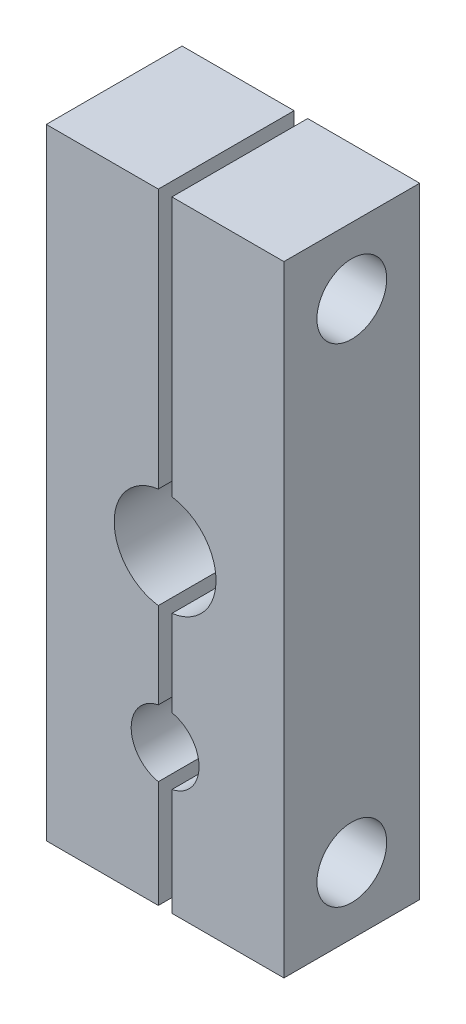
ISO-10303-21;
HEADER;
FILE_DESCRIPTION(('STEP AP214'),'2;1');
FILE_NAME('part.step','',(''),(''),'','','');
FILE_SCHEMA(('AUTOMOTIVE_DESIGN { 1 0 10303 214 1 1 1 1 }'));
ENDSEC;
DATA;
#1=APPLICATION_CONTEXT('core data for automotive mechanical design processes');
#2=APPLICATION_PROTOCOL_DEFINITION('international standard','automotive_design',2000,#1);
#3=PRODUCT_CONTEXT('',#1,'mechanical');
#4=PRODUCT('Part','Part','',(#3));
#5=PRODUCT_RELATED_PRODUCT_CATEGORY('part','',(#4));
#6=PRODUCT_DEFINITION_FORMATION('','',#4);
#7=PRODUCT_DEFINITION_CONTEXT('part definition',#1,'design');
#8=PRODUCT_DEFINITION('design','',#6,#7);
#9=PRODUCT_DEFINITION_SHAPE('','',#8);
#10=(LENGTH_UNIT() NAMED_UNIT(*) SI_UNIT(.MILLI.,.METRE.));
#11=(NAMED_UNIT(*) PLANE_ANGLE_UNIT() SI_UNIT($,.RADIAN.));
#12=(NAMED_UNIT(*) SI_UNIT($,.STERADIAN.) SOLID_ANGLE_UNIT());
#13=UNCERTAINTY_MEASURE_WITH_UNIT(LENGTH_MEASURE(1.E-05),#10,'distance_accuracy_value','');
#14=(GEOMETRIC_REPRESENTATION_CONTEXT(3) GLOBAL_UNCERTAINTY_ASSIGNED_CONTEXT((#13)) GLOBAL_UNIT_ASSIGNED_CONTEXT((#10,
#11,#12)) REPRESENTATION_CONTEXT('',''));
#15=CARTESIAN_POINT('',(0.,0.,0.));
#16=DIRECTION('',(0.,0.,1.));
#17=DIRECTION('',(1.,0.,0.));
#18=AXIS2_PLACEMENT_3D('',#15,#16,#17);
#19=CARTESIAN_POINT('',(0.,0.,6.35));
#20=DIRECTION('',(0.,0.,-1.));
#21=DIRECTION('',(-1.,0.,0.));
#22=AXIS2_PLACEMENT_3D('',#19,#20,#21);
#23=PLANE('',#22);
#24=DIRECTION('',(-1.,0.,0.));
#25=VECTOR('',#24,1.);
#26=CARTESIAN_POINT('',(-11.1125,29.013726834,6.35));
#27=LINE('',#26,#25);
#28=CARTESIAN_POINT('',(11.1125,29.013726834,6.35));
#29=VERTEX_POINT('',#28);
#30=CARTESIAN_POINT('',(0.635000000000004,29.013726834,6.35));
#31=VERTEX_POINT('',#30);
#32=EDGE_CURVE('E155',#29,#31,#27,.T.);
#33=ORIENTED_EDGE('',*,*,#32,.T.);
#34=DIRECTION('',(0.,1.,0.));
#35=VECTOR('',#34,1.);
#36=CARTESIAN_POINT('',(0.635000000000004,-31.0103254822764,6.35));
#37=LINE('',#36,#35);
#38=CARTESIAN_POINT('',(0.635000000000003,4.71997682727362,6.35));
#39=VERTEX_POINT('',#38);
#40=EDGE_CURVE('E56',#39,#31,#37,.T.);
#41=ORIENTED_EDGE('',*,*,#40,.F.);
#42=CARTESIAN_POINT('',(0.,0.,6.35));
#43=DIRECTION('',(0.,0.,1.));
#44=DIRECTION('',(1.,0.,0.));
#45=AXIS2_PLACEMENT_3D('',#42,#43,#44);
#46=CIRCLE('',#45,4.7625);
#47=CARTESIAN_POINT('',(0.635000000000003,-4.71997682727362,6.35));
#48=VERTEX_POINT('',#47);
#49=EDGE_CURVE('E124',#48,#39,#46,.T.);
#50=ORIENTED_EDGE('',*,*,#49,.F.);
#51=CARTESIAN_POINT('',(0.635000000000003,-12.7641480266654,6.35));
#52=VERTEX_POINT('',#51);
#53=EDGE_CURVE('E12',#52,#48,#37,.T.);
#54=ORIENTED_EDGE('',*,*,#53,.F.);
#55=CARTESIAN_POINT('',(0.,-15.875,6.35));
#56=DIRECTION('',(0.,0.,1.));
#57=DIRECTION('',(1.,0.,0.));
#58=AXIS2_PLACEMENT_3D('',#55,#56,#57);
#59=CIRCLE('',#58,3.175);
#60=CARTESIAN_POINT('',(0.635000000000003,-18.9858519733346,6.35));
#61=VERTEX_POINT('',#60);
#62=EDGE_CURVE('E134',#61,#52,#59,.T.);
#63=ORIENTED_EDGE('',*,*,#62,.F.);
#64=CARTESIAN_POINT('',(0.635000000000004,-29.013726834,6.35));
#65=VERTEX_POINT('',#64);
#66=EDGE_CURVE('E55',#65,#61,#37,.T.);
#67=ORIENTED_EDGE('',*,*,#66,.F.);
#68=DIRECTION('',(1.,0.,0.));
#69=VECTOR('',#68,1.);
#70=CARTESIAN_POINT('',(-11.1125,-29.013726834,6.35));
#71=LINE('',#70,#69);
#72=CARTESIAN_POINT('',(11.1125,-29.013726834,6.35));
#73=VERTEX_POINT('',#72);
#74=EDGE_CURVE('E158',#65,#73,#71,.T.);
#75=ORIENTED_EDGE('',*,*,#74,.T.);
#76=DIRECTION('',(0.,1.,0.));
#77=VECTOR('',#76,1.);
#78=CARTESIAN_POINT('',(11.1125,-29.013726834,6.35));
#79=LINE('',#78,#77);
#80=EDGE_CURVE('E115',#73,#29,#79,.T.);
#81=ORIENTED_EDGE('',*,*,#80,.T.);
#82=EDGE_LOOP('',(#33,#41,#50,#54,#63,#67,#75,#81));
#83=FACE_BOUND('',#82,.T.);
#84=ADVANCED_FACE('F43',(#83),#23,.F.);
#85=CARTESIAN_POINT('',(0.,0.,-6.35));
#86=DIRECTION('',(0.,0.,-1.));
#87=DIRECTION('',(-1.,0.,0.));
#88=AXIS2_PLACEMENT_3D('',#85,#86,#87);
#89=PLANE('',#88);
#90=DIRECTION('',(0.,1.,0.));
#91=VECTOR('',#90,1.);
#92=CARTESIAN_POINT('',(0.635000000000004,-31.0103254822764,-6.35));
#93=LINE('',#92,#91);
#94=CARTESIAN_POINT('',(0.635000000000004,4.71997682727363,-6.35));
#95=VERTEX_POINT('',#94);
#96=CARTESIAN_POINT('',(0.635000000000004,29.013726834,-6.35));
#97=VERTEX_POINT('',#96);
#98=EDGE_CURVE('E104',#95,#97,#93,.T.);
#99=ORIENTED_EDGE('',*,*,#98,.T.);
#100=DIRECTION('',(-1.,0.,0.));
#101=VECTOR('',#100,1.);
#102=CARTESIAN_POINT('',(-11.1125,29.013726834,-6.35));
#103=LINE('',#102,#101);
#104=CARTESIAN_POINT('',(11.1125,29.013726834,-6.35));
#105=VERTEX_POINT('',#104);
#106=EDGE_CURVE('E130',#105,#97,#103,.T.);
#107=ORIENTED_EDGE('',*,*,#106,.F.);
#108=DIRECTION('',(0.,1.,0.));
#109=VECTOR('',#108,1.);
#110=CARTESIAN_POINT('',(11.1125,-29.013726834,-6.35));
#111=LINE('',#110,#109);
#112=CARTESIAN_POINT('',(11.1125,-29.013726834,-6.35));
#113=VERTEX_POINT('',#112);
#114=EDGE_CURVE('E172',#113,#105,#111,.T.);
#115=ORIENTED_EDGE('',*,*,#114,.F.);
#116=DIRECTION('',(1.,0.,0.));
#117=VECTOR('',#116,1.);
#118=CARTESIAN_POINT('',(-11.1125,-29.013726834,-6.35));
#119=LINE('',#118,#117);
#120=CARTESIAN_POINT('',(0.635000000000004,-29.013726834,-6.35));
#121=VERTEX_POINT('',#120);
#122=EDGE_CURVE('E144',#121,#113,#119,.T.);
#123=ORIENTED_EDGE('',*,*,#122,.F.);
#124=CARTESIAN_POINT('',(0.635000000000003,-18.9858519733346,-6.35));
#125=VERTEX_POINT('',#124);
#126=EDGE_CURVE('E114',#121,#125,#93,.T.);
#127=ORIENTED_EDGE('',*,*,#126,.T.);
#128=CARTESIAN_POINT('',(0.,-15.875,-6.35));
#129=DIRECTION('',(0.,0.,1.));
#130=DIRECTION('',(1.,0.,0.));
#131=AXIS2_PLACEMENT_3D('',#128,#129,#130);
#132=CIRCLE('',#131,3.175);
#133=CARTESIAN_POINT('',(0.635000000000003,-12.7641480266654,-6.35));
#134=VERTEX_POINT('',#133);
#135=EDGE_CURVE('E47',#125,#134,#132,.T.);
#136=ORIENTED_EDGE('',*,*,#135,.T.);
#137=CARTESIAN_POINT('',(0.635000000000003,-4.71997682727362,-6.35));
#138=VERTEX_POINT('',#137);
#139=EDGE_CURVE('E117',#134,#138,#93,.T.);
#140=ORIENTED_EDGE('',*,*,#139,.T.);
#141=CARTESIAN_POINT('',(0.,0.,-6.35));
#142=DIRECTION('',(0.,0.,1.));
#143=DIRECTION('',(1.,0.,0.));
#144=AXIS2_PLACEMENT_3D('',#141,#142,#143);
#145=CIRCLE('',#144,4.7625);
#146=EDGE_CURVE('E122',#138,#95,#145,.T.);
#147=ORIENTED_EDGE('',*,*,#146,.T.);
#148=EDGE_LOOP('',(#99,#107,#115,#123,#127,#136,#140,#147));
#149=FACE_BOUND('',#148,.T.);
#150=ADVANCED_FACE('F128',(#149),#89,.T.);
#151=CARTESIAN_POINT('',(-11.1125,29.013726834,6.35));
#152=DIRECTION('',(0.,-1.,0.));
#153=DIRECTION('',(0.,0.,-1.));
#154=AXIS2_PLACEMENT_3D('',#151,#152,#153);
#155=PLANE('',#154);
#156=ORIENTED_EDGE('',*,*,#106,.T.);
#157=DIRECTION('',(0.,0.,1.));
#158=VECTOR('',#157,1.);
#159=CARTESIAN_POINT('',(0.635000000000004,29.013726834,6.35));
#160=LINE('',#159,#158);
#161=EDGE_CURVE('E110',#97,#31,#160,.T.);
#162=ORIENTED_EDGE('',*,*,#161,.T.);
#163=ORIENTED_EDGE('',*,*,#32,.F.);
#164=DIRECTION('',(0.,0.,-1.));
#165=VECTOR('',#164,1.);
#166=CARTESIAN_POINT('',(11.1125,29.013726834,6.35));
#167=LINE('',#166,#165);
#168=EDGE_CURVE('E152',#29,#105,#167,.T.);
#169=ORIENTED_EDGE('',*,*,#168,.T.);
#170=EDGE_LOOP('',(#156,#162,#163,#169));
#171=FACE_BOUND('',#170,.T.);
#172=ADVANCED_FACE('F205',(#171),#155,.F.);
#173=CARTESIAN_POINT('',(-11.1125,-29.013726834,6.35));
#174=DIRECTION('',(0.,1.,0.));
#175=DIRECTION('',(0.,0.,1.));
#176=AXIS2_PLACEMENT_3D('',#173,#174,#175);
#177=PLANE('',#176);
#178=ORIENTED_EDGE('',*,*,#74,.F.);
#179=DIRECTION('',(0.,0.,-1.));
#180=VECTOR('',#179,1.);
#181=CARTESIAN_POINT('',(0.635000000000004,-29.013726834,6.35));
#182=LINE('',#181,#180);
#183=EDGE_CURVE('E145',#65,#121,#182,.T.);
#184=ORIENTED_EDGE('',*,*,#183,.T.);
#185=ORIENTED_EDGE('',*,*,#122,.T.);
#186=DIRECTION('',(0.,0.,-1.));
#187=VECTOR('',#186,1.);
#188=CARTESIAN_POINT('',(11.1125,-29.013726834,6.35));
#189=LINE('',#188,#187);
#190=EDGE_CURVE('E125',#73,#113,#189,.T.);
#191=ORIENTED_EDGE('',*,*,#190,.F.);
#192=EDGE_LOOP('',(#178,#184,#185,#191));
#193=FACE_BOUND('',#192,.T.);
#194=ADVANCED_FACE('F228',(#193),#177,.F.);
#195=CARTESIAN_POINT('',(0.,0.,6.35));
#196=DIRECTION('',(0.,0.,-1.));
#197=DIRECTION('',(-1.,0.,0.));
#198=AXIS2_PLACEMENT_3D('',#195,#196,#197);
#199=CYLINDRICAL_SURFACE('',#198,4.7625);
#200=DIRECTION('',(0.,0.,-1.));
#201=VECTOR('',#200,1.);
#202=CARTESIAN_POINT('',(0.635000000000004,-4.71997682727363,6.35));
#203=LINE('',#202,#201);
#204=EDGE_CURVE('E161',#48,#138,#203,.T.);
#205=ORIENTED_EDGE('',*,*,#204,.F.);
#206=ORIENTED_EDGE('',*,*,#49,.T.);
#207=DIRECTION('',(0.,0.,-1.));
#208=VECTOR('',#207,1.);
#209=CARTESIAN_POINT('',(0.635000000000004,4.71997682727363,6.35));
#210=LINE('',#209,#208);
#211=EDGE_CURVE('E107',#95,#39,#210,.F.);
#212=ORIENTED_EDGE('',*,*,#211,.F.);
#213=ORIENTED_EDGE('',*,*,#146,.F.);
#214=EDGE_LOOP('',(#205,#206,#212,#213));
#215=FACE_BOUND('',#214,.T.);
#216=ADVANCED_FACE('F121',(#215),#199,.F.);
#217=CARTESIAN_POINT('',(0.,-15.875,6.35));
#218=DIRECTION('',(0.,0.,-1.));
#219=DIRECTION('',(-1.,0.,0.));
#220=AXIS2_PLACEMENT_3D('',#217,#218,#219);
#221=CYLINDRICAL_SURFACE('',#220,3.175);
#222=DIRECTION('',(0.,0.,-1.));
#223=VECTOR('',#222,1.);
#224=CARTESIAN_POINT('',(0.635000000000004,-18.9858519733346,6.35));
#225=LINE('',#224,#223);
#226=EDGE_CURVE('E162',#61,#125,#225,.T.);
#227=ORIENTED_EDGE('',*,*,#226,.F.);
#228=ORIENTED_EDGE('',*,*,#62,.T.);
#229=DIRECTION('',(0.,0.,-1.));
#230=VECTOR('',#229,1.);
#231=CARTESIAN_POINT('',(0.635000000000004,-12.7641480266654,6.35));
#232=LINE('',#231,#230);
#233=EDGE_CURVE('E53',#134,#52,#232,.F.);
#234=ORIENTED_EDGE('',*,*,#233,.F.);
#235=ORIENTED_EDGE('',*,*,#135,.F.);
#236=EDGE_LOOP('',(#227,#228,#234,#235));
#237=FACE_BOUND('',#236,.T.);
#238=ADVANCED_FACE('F210',(#237),#221,.F.);
#239=CARTESIAN_POINT('',(-11.1125,-22.8203125,0.));
#240=DIRECTION('',(-1.,0.,0.));
#241=DIRECTION('',(0.,0.,1.));
#242=AXIS2_PLACEMENT_3D('',#239,#240,#241);
#243=CYLINDRICAL_SURFACE('',#242,3.2639);
#244=CARTESIAN_POINT('',(0.635000000000004,-22.8203125,0.));
#245=DIRECTION('',(1.,0.,0.));
#246=DIRECTION('',(0.,0.,-1.));
#247=AXIS2_PLACEMENT_3D('',#244,#245,#246);
#248=CIRCLE('',#247,3.2639);
#249=CARTESIAN_POINT('',(0.635000000000004,-22.8203125,-3.26389999999999));
#250=VERTEX_POINT('',#249);
#251=EDGE_CURVE('E136',#250,#250,#248,.F.);
#252=ORIENTED_EDGE('',*,*,#251,.T.);
#253=EDGE_LOOP('',(#252));
#254=FACE_BOUND('',#253,.T.);
#255=CARTESIAN_POINT('',(11.1125,-22.8203125,0.));
#256=DIRECTION('',(-1.,0.,0.));
#257=DIRECTION('',(0.,0.,1.));
#258=AXIS2_PLACEMENT_3D('',#255,#256,#257);
#259=CIRCLE('',#258,3.26389999999999);
#260=CARTESIAN_POINT('',(11.1125,-22.8203125,3.2639));
#261=VERTEX_POINT('',#260);
#262=EDGE_CURVE('E169',#261,#261,#259,.T.);
#263=ORIENTED_EDGE('',*,*,#262,.F.);
#264=EDGE_LOOP('',(#263));
#265=FACE_BOUND('',#264,.T.);
#266=ADVANCED_FACE('F208',(#254,#265),#243,.F.);
#267=CARTESIAN_POINT('',(-11.1125,22.8203125,0.));
#268=DIRECTION('',(-1.,0.,0.));
#269=DIRECTION('',(0.,0.,1.));
#270=AXIS2_PLACEMENT_3D('',#267,#268,#269);
#271=CYLINDRICAL_SURFACE('',#270,3.2639);
#272=CARTESIAN_POINT('',(0.635000000000004,22.8203125,0.));
#273=DIRECTION('',(1.,0.,0.));
#274=DIRECTION('',(0.,0.,-1.));
#275=AXIS2_PLACEMENT_3D('',#272,#273,#274);
#276=CIRCLE('',#275,3.2639);
#277=CARTESIAN_POINT('',(0.635000000000004,22.8203125,-3.26389999999999));
#278=VERTEX_POINT('',#277);
#279=EDGE_CURVE('E142',#278,#278,#276,.F.);
#280=ORIENTED_EDGE('',*,*,#279,.T.);
#281=EDGE_LOOP('',(#280));
#282=FACE_BOUND('',#281,.T.);
#283=CARTESIAN_POINT('',(11.1125,22.8203125,0.));
#284=DIRECTION('',(-1.,0.,0.));
#285=DIRECTION('',(0.,0.,1.));
#286=AXIS2_PLACEMENT_3D('',#283,#284,#285);
#287=CIRCLE('',#286,3.26389999999999);
#288=CARTESIAN_POINT('',(11.1125,22.8203125,3.2639));
#289=VERTEX_POINT('',#288);
#290=EDGE_CURVE('E166',#289,#289,#287,.T.);
#291=ORIENTED_EDGE('',*,*,#290,.F.);
#292=EDGE_LOOP('',(#291));
#293=FACE_BOUND('',#292,.T.);
#294=ADVANCED_FACE('F45',(#282,#293),#271,.F.);
#295=CARTESIAN_POINT('',(11.1125,-29.013726834,6.35));
#296=DIRECTION('',(-1.,0.,0.));
#297=DIRECTION('',(0.,0.,1.));
#298=AXIS2_PLACEMENT_3D('',#295,#296,#297);
#299=PLANE('',#298);
#300=ORIENTED_EDGE('',*,*,#290,.T.);
#301=EDGE_LOOP('',(#300));
#302=FACE_BOUND('',#301,.T.);
#303=ORIENTED_EDGE('',*,*,#262,.T.);
#304=EDGE_LOOP('',(#303));
#305=FACE_BOUND('',#304,.T.);
#306=ORIENTED_EDGE('',*,*,#114,.T.);
#307=ORIENTED_EDGE('',*,*,#168,.F.);
#308=ORIENTED_EDGE('',*,*,#80,.F.);
#309=ORIENTED_EDGE('',*,*,#190,.T.);
#310=EDGE_LOOP('',(#306,#307,#308,#309));
#311=FACE_BOUND('',#310,.T.);
#312=ADVANCED_FACE('F187',(#302,#305,#311),#299,.F.);
#313=CARTESIAN_POINT('',(0.635000000000004,-31.0103254822764,-6.35));
#314=DIRECTION('',(1.,0.,0.));
#315=DIRECTION('',(0.,0.,-1.));
#316=AXIS2_PLACEMENT_3D('',#313,#314,#315);
#317=PLANE('',#316);
#318=ORIENTED_EDGE('',*,*,#279,.F.);
#319=EDGE_LOOP('',(#318));
#320=FACE_BOUND('',#319,.T.);
#321=ORIENTED_EDGE('',*,*,#98,.F.);
#322=ORIENTED_EDGE('',*,*,#211,.T.);
#323=ORIENTED_EDGE('',*,*,#40,.T.);
#324=ORIENTED_EDGE('',*,*,#161,.F.);
#325=EDGE_LOOP('',(#321,#322,#323,#324));
#326=FACE_BOUND('',#325,.T.);
#327=ADVANCED_FACE('F106',(#320,#326),#317,.F.);
#328=ORIENTED_EDGE('',*,*,#251,.F.);
#329=EDGE_LOOP('',(#328));
#330=FACE_BOUND('',#329,.T.);
#331=ORIENTED_EDGE('',*,*,#66,.T.);
#332=ORIENTED_EDGE('',*,*,#226,.T.);
#333=ORIENTED_EDGE('',*,*,#126,.F.);
#334=ORIENTED_EDGE('',*,*,#183,.F.);
#335=EDGE_LOOP('',(#331,#332,#333,#334));
#336=FACE_BOUND('',#335,.T.);
#337=ADVANCED_FACE('F186',(#330,#336),#317,.F.);
#338=ORIENTED_EDGE('',*,*,#204,.T.);
#339=ORIENTED_EDGE('',*,*,#139,.F.);
#340=ORIENTED_EDGE('',*,*,#233,.T.);
#341=ORIENTED_EDGE('',*,*,#53,.T.);
#342=EDGE_LOOP('',(#338,#339,#340,#341));
#343=FACE_BOUND('',#342,.T.);
#344=ADVANCED_FACE('F189',(#343),#317,.F.);
#345=CLOSED_SHELL('',(#84,#150,#172,#194,#216,#238,#266,#294,#312,#327,#337,#344));
#346=MANIFOLD_SOLID_BREP('B2',#345);
#347=CARTESIAN_POINT('',(0.,-15.875,6.35));
#348=DIRECTION('',(0.,0.,-1.));
#349=DIRECTION('',(-1.,0.,0.));
#350=AXIS2_PLACEMENT_3D('',#347,#348,#349);
#351=CYLINDRICAL_SURFACE('',#350,3.175);
#352=DIRECTION('',(0.,0.,-1.));
#353=VECTOR('',#352,1.);
#354=CARTESIAN_POINT('',(-0.634999999999997,-12.7641480266654,6.35));
#355=LINE('',#354,#353);
#356=CARTESIAN_POINT('',(-0.634999999999996,-12.7641480266654,6.35));
#357=VERTEX_POINT('',#356);
#358=CARTESIAN_POINT('',(-0.634999999999996,-12.7641480266654,-6.35));
#359=VERTEX_POINT('',#358);
#360=EDGE_CURVE('E438',#357,#359,#355,.T.);
#361=ORIENTED_EDGE('',*,*,#360,.F.);
#362=CARTESIAN_POINT('',(0.,-15.875,6.35));
#363=DIRECTION('',(0.,0.,1.));
#364=DIRECTION('',(1.,0.,0.));
#365=AXIS2_PLACEMENT_3D('',#362,#363,#364);
#366=CIRCLE('',#365,3.175);
#367=CARTESIAN_POINT('',(-0.634999999999996,-18.9858519733346,6.35));
#368=VERTEX_POINT('',#367);
#369=EDGE_CURVE('E452',#357,#368,#366,.T.);
#370=ORIENTED_EDGE('',*,*,#369,.T.);
#371=DIRECTION('',(0.,0.,-1.));
#372=VECTOR('',#371,1.);
#373=CARTESIAN_POINT('',(-0.634999999999997,-18.9858519733346,6.35));
#374=LINE('',#373,#372);
#375=CARTESIAN_POINT('',(-0.634999999999996,-18.9858519733346,-6.35));
#376=VERTEX_POINT('',#375);
#377=EDGE_CURVE('E435',#376,#368,#374,.F.);
#378=ORIENTED_EDGE('',*,*,#377,.F.);
#379=CARTESIAN_POINT('',(0.,-15.875,-6.35));
#380=DIRECTION('',(0.,0.,1.));
#381=DIRECTION('',(1.,0.,0.));
#382=AXIS2_PLACEMENT_3D('',#379,#380,#381);
#383=CIRCLE('',#382,3.175);
#384=EDGE_CURVE('E424',#359,#376,#383,.T.);
#385=ORIENTED_EDGE('',*,*,#384,.F.);
#386=EDGE_LOOP('',(#361,#370,#378,#385));
#387=FACE_BOUND('',#386,.T.);
#388=ADVANCED_FACE('F307',(#387),#351,.F.);
#389=CARTESIAN_POINT('',(0.,0.,6.35));
#390=DIRECTION('',(0.,0.,-1.));
#391=DIRECTION('',(-1.,0.,0.));
#392=AXIS2_PLACEMENT_3D('',#389,#390,#391);
#393=CYLINDRICAL_SURFACE('',#392,4.7625);
#394=DIRECTION('',(0.,0.,-1.));
#395=VECTOR('',#394,1.);
#396=CARTESIAN_POINT('',(-0.634999999999997,4.71997682727363,6.35));
#397=LINE('',#396,#395);
#398=CARTESIAN_POINT('',(-0.634999999999997,4.71997682727363,6.35));
#399=VERTEX_POINT('',#398);
#400=CARTESIAN_POINT('',(-0.634999999999996,4.71997682727362,-6.35));
#401=VERTEX_POINT('',#400);
#402=EDGE_CURVE('E444',#399,#401,#397,.T.);
#403=ORIENTED_EDGE('',*,*,#402,.F.);
#404=CARTESIAN_POINT('',(0.,0.,6.35));
#405=DIRECTION('',(0.,0.,1.));
#406=DIRECTION('',(1.,0.,0.));
#407=AXIS2_PLACEMENT_3D('',#404,#405,#406);
#408=CIRCLE('',#407,4.7625);
#409=CARTESIAN_POINT('',(-0.634999999999996,-4.71997682727362,6.35));
#410=VERTEX_POINT('',#409);
#411=EDGE_CURVE('E389',#399,#410,#408,.T.);
#412=ORIENTED_EDGE('',*,*,#411,.T.);
#413=DIRECTION('',(0.,0.,-1.));
#414=VECTOR('',#413,1.);
#415=CARTESIAN_POINT('',(-0.634999999999997,-4.71997682727363,6.35));
#416=LINE('',#415,#414);
#417=CARTESIAN_POINT('',(-0.634999999999996,-4.71997682727362,-6.35));
#418=VERTEX_POINT('',#417);
#419=EDGE_CURVE('E442',#418,#410,#416,.F.);
#420=ORIENTED_EDGE('',*,*,#419,.F.);
#421=CARTESIAN_POINT('',(0.,0.,-6.35));
#422=DIRECTION('',(0.,0.,1.));
#423=DIRECTION('',(1.,0.,0.));
#424=AXIS2_PLACEMENT_3D('',#421,#422,#423);
#425=CIRCLE('',#424,4.7625);
#426=EDGE_CURVE('E403',#401,#418,#425,.T.);
#427=ORIENTED_EDGE('',*,*,#426,.F.);
#428=EDGE_LOOP('',(#403,#412,#420,#427));
#429=FACE_BOUND('',#428,.T.);
#430=ADVANCED_FACE('F457',(#429),#393,.F.);
#431=CARTESIAN_POINT('',(-11.1125,29.013726834,6.35));
#432=DIRECTION('',(0.,-1.,0.));
#433=DIRECTION('',(0.,0.,-1.));
#434=AXIS2_PLACEMENT_3D('',#431,#432,#433);
#435=PLANE('',#434);
#436=DIRECTION('',(-1.,0.,0.));
#437=VECTOR('',#436,1.);
#438=CARTESIAN_POINT('',(-11.1125,29.013726834,6.35));
#439=LINE('',#438,#437);
#440=CARTESIAN_POINT('',(-0.634999999999997,29.013726834,6.35));
#441=VERTEX_POINT('',#440);
#442=CARTESIAN_POINT('',(-11.1125,29.013726834,6.35));
#443=VERTEX_POINT('',#442);
#444=EDGE_CURVE('E385',#441,#443,#439,.T.);
#445=ORIENTED_EDGE('',*,*,#444,.F.);
#446=DIRECTION('',(0.,0.,-1.));
#447=VECTOR('',#446,1.);
#448=CARTESIAN_POINT('',(-0.634999999999997,29.013726834,6.35));
#449=LINE('',#448,#447);
#450=CARTESIAN_POINT('',(-0.634999999999997,29.013726834,-6.35));
#451=VERTEX_POINT('',#450);
#452=EDGE_CURVE('E371',#441,#451,#449,.T.);
#453=ORIENTED_EDGE('',*,*,#452,.T.);
#454=DIRECTION('',(-1.,0.,0.));
#455=VECTOR('',#454,1.);
#456=CARTESIAN_POINT('',(-11.1125,29.013726834,-6.35));
#457=LINE('',#456,#455);
#458=CARTESIAN_POINT('',(-11.1125,29.013726834,-6.35));
#459=VERTEX_POINT('',#458);
#460=EDGE_CURVE('E407',#451,#459,#457,.T.);
#461=ORIENTED_EDGE('',*,*,#460,.T.);
#462=DIRECTION('',(0.,0.,-1.));
#463=VECTOR('',#462,1.);
#464=CARTESIAN_POINT('',(-11.1125,29.013726834,6.35));
#465=LINE('',#464,#463);
#466=EDGE_CURVE('E41',#443,#459,#465,.T.);
#467=ORIENTED_EDGE('',*,*,#466,.F.);
#468=EDGE_LOOP('',(#445,#453,#461,#467));
#469=FACE_BOUND('',#468,.T.);
#470=ADVANCED_FACE('F309',(#469),#435,.F.);
#471=CARTESIAN_POINT('',(-11.1125,-29.013726834,6.35));
#472=DIRECTION('',(0.,1.,0.));
#473=DIRECTION('',(0.,0.,1.));
#474=AXIS2_PLACEMENT_3D('',#471,#472,#473);
#475=PLANE('',#474);
#476=DIRECTION('',(1.,0.,0.));
#477=VECTOR('',#476,1.);
#478=CARTESIAN_POINT('',(-11.1125,-29.013726834,-6.35));
#479=LINE('',#478,#477);
#480=CARTESIAN_POINT('',(-11.1125,-29.013726834,-6.35));
#481=VERTEX_POINT('',#480);
#482=CARTESIAN_POINT('',(-0.634999999999997,-29.013726834,-6.35));
#483=VERTEX_POINT('',#482);
#484=EDGE_CURVE('E395',#481,#483,#479,.T.);
#485=ORIENTED_EDGE('',*,*,#484,.T.);
#486=DIRECTION('',(0.,0.,1.));
#487=VECTOR('',#486,1.);
#488=CARTESIAN_POINT('',(-0.634999999999997,-29.013726834,6.35));
#489=LINE('',#488,#487);
#490=CARTESIAN_POINT('',(-0.634999999999997,-29.013726834,6.35));
#491=VERTEX_POINT('',#490);
#492=EDGE_CURVE('E379',#483,#491,#489,.T.);
#493=ORIENTED_EDGE('',*,*,#492,.T.);
#494=DIRECTION('',(1.,0.,0.));
#495=VECTOR('',#494,1.);
#496=CARTESIAN_POINT('',(-11.1125,-29.013726834,6.35));
#497=LINE('',#496,#495);
#498=CARTESIAN_POINT('',(-11.1125,-29.013726834,6.35));
#499=VERTEX_POINT('',#498);
#500=EDGE_CURVE('E397',#499,#491,#497,.T.);
#501=ORIENTED_EDGE('',*,*,#500,.F.);
#502=DIRECTION('',(0.,0.,-1.));
#503=VECTOR('',#502,1.);
#504=CARTESIAN_POINT('',(-11.1125,-29.013726834,6.35));
#505=LINE('',#504,#503);
#506=EDGE_CURVE('E316',#499,#481,#505,.T.);
#507=ORIENTED_EDGE('',*,*,#506,.T.);
#508=EDGE_LOOP('',(#485,#493,#501,#507));
#509=FACE_BOUND('',#508,.T.);
#510=ADVANCED_FACE('F415',(#509),#475,.F.);
#511=CARTESIAN_POINT('',(0.,0.,-6.35));
#512=DIRECTION('',(0.,0.,-1.));
#513=DIRECTION('',(-1.,0.,0.));
#514=AXIS2_PLACEMENT_3D('',#511,#512,#513);
#515=PLANE('',#514);
#516=DIRECTION('',(0.,-1.,0.));
#517=VECTOR('',#516,1.);
#518=CARTESIAN_POINT('',(-0.634999999999997,-31.0103254822764,-6.35));
#519=LINE('',#518,#517);
#520=EDGE_CURVE('E331',#376,#483,#519,.T.);
#521=ORIENTED_EDGE('',*,*,#520,.T.);
#522=ORIENTED_EDGE('',*,*,#484,.F.);
#523=DIRECTION('',(0.,-1.,0.));
#524=VECTOR('',#523,1.);
#525=CARTESIAN_POINT('',(-11.1125,-29.013726834,-6.35));
#526=LINE('',#525,#524);
#527=EDGE_CURVE('E400',#459,#481,#526,.T.);
#528=ORIENTED_EDGE('',*,*,#527,.F.);
#529=ORIENTED_EDGE('',*,*,#460,.F.);
#530=EDGE_CURVE('E374',#451,#401,#519,.T.);
#531=ORIENTED_EDGE('',*,*,#530,.T.);
#532=ORIENTED_EDGE('',*,*,#426,.T.);
#533=EDGE_CURVE('E425',#418,#359,#519,.T.);
#534=ORIENTED_EDGE('',*,*,#533,.T.);
#535=ORIENTED_EDGE('',*,*,#384,.T.);
#536=EDGE_LOOP('',(#521,#522,#528,#529,#531,#532,#534,#535));
#537=FACE_BOUND('',#536,.T.);
#538=ADVANCED_FACE('F420',(#537),#515,.T.);
#539=CARTESIAN_POINT('',(0.,0.,6.35));
#540=DIRECTION('',(0.,0.,-1.));
#541=DIRECTION('',(-1.,0.,0.));
#542=AXIS2_PLACEMENT_3D('',#539,#540,#541);
#543=PLANE('',#542);
#544=ORIENTED_EDGE('',*,*,#500,.T.);
#545=DIRECTION('',(0.,-1.,0.));
#546=VECTOR('',#545,1.);
#547=CARTESIAN_POINT('',(-0.634999999999997,-31.0103254822764,6.35));
#548=LINE('',#547,#546);
#549=EDGE_CURVE('E392',#368,#491,#548,.T.);
#550=ORIENTED_EDGE('',*,*,#549,.F.);
#551=ORIENTED_EDGE('',*,*,#369,.F.);
#552=EDGE_CURVE('E390',#410,#357,#548,.T.);
#553=ORIENTED_EDGE('',*,*,#552,.F.);
#554=ORIENTED_EDGE('',*,*,#411,.F.);
#555=EDGE_CURVE('E323',#441,#399,#548,.T.);
#556=ORIENTED_EDGE('',*,*,#555,.F.);
#557=ORIENTED_EDGE('',*,*,#444,.T.);
#558=DIRECTION('',(0.,-1.,0.));
#559=VECTOR('',#558,1.);
#560=CARTESIAN_POINT('',(-11.1125,-29.013726834,6.35));
#561=LINE('',#560,#559);
#562=EDGE_CURVE('E394',#443,#499,#561,.T.);
#563=ORIENTED_EDGE('',*,*,#562,.T.);
#564=EDGE_LOOP('',(#544,#550,#551,#553,#554,#556,#557,#563));
#565=FACE_BOUND('',#564,.T.);
#566=ADVANCED_FACE('F384',(#565),#543,.F.);
#567=CARTESIAN_POINT('',(-11.1125,-22.8203125,0.));
#568=DIRECTION('',(-1.,0.,0.));
#569=DIRECTION('',(0.,0.,1.));
#570=AXIS2_PLACEMENT_3D('',#567,#568,#569);
#571=CYLINDRICAL_SURFACE('',#570,3.2639);
#572=CARTESIAN_POINT('',(-0.634999999999997,-22.8203125,0.));
#573=DIRECTION('',(-1.,0.,0.));
#574=DIRECTION('',(0.,0.,1.));
#575=AXIS2_PLACEMENT_3D('',#572,#573,#574);
#576=CIRCLE('',#575,3.2639);
#577=CARTESIAN_POINT('',(-0.634999999999997,-22.8203125,3.2639));
#578=VERTEX_POINT('',#577);
#579=EDGE_CURVE('E431',#578,#578,#576,.F.);
#580=ORIENTED_EDGE('',*,*,#579,.T.);
#581=EDGE_LOOP('',(#580));
#582=FACE_BOUND('',#581,.T.);
#583=CARTESIAN_POINT('',(-11.1125,-22.8203125,0.));
#584=DIRECTION('',(-1.,0.,0.));
#585=DIRECTION('',(0.,0.,1.));
#586=AXIS2_PLACEMENT_3D('',#583,#584,#585);
#587=CIRCLE('',#586,3.2639);
#588=CARTESIAN_POINT('',(-11.1125,-22.8203125,3.2639));
#589=VERTEX_POINT('',#588);
#590=EDGE_CURVE('E449',#589,#589,#587,.T.);
#591=ORIENTED_EDGE('',*,*,#590,.T.);
#592=EDGE_LOOP('',(#591));
#593=FACE_BOUND('',#592,.T.);
#594=ADVANCED_FACE('F467',(#582,#593),#571,.F.);
#595=CARTESIAN_POINT('',(-11.1125,-29.013726834,6.35));
#596=DIRECTION('',(1.,0.,0.));
#597=DIRECTION('',(0.,0.,-1.));
#598=AXIS2_PLACEMENT_3D('',#595,#596,#597);
#599=PLANE('',#598);
#600=CARTESIAN_POINT('',(-11.1125,22.8203125,0.));
#601=DIRECTION('',(-1.,0.,0.));
#602=DIRECTION('',(0.,0.,1.));
#603=AXIS2_PLACEMENT_3D('',#600,#601,#602);
#604=CIRCLE('',#603,3.2639);
#605=CARTESIAN_POINT('',(-11.1125,22.8203125,3.2639));
#606=VERTEX_POINT('',#605);
#607=EDGE_CURVE('E378',#606,#606,#604,.T.);
#608=ORIENTED_EDGE('',*,*,#607,.F.);
#609=EDGE_LOOP('',(#608));
#610=FACE_BOUND('',#609,.T.);
#611=ORIENTED_EDGE('',*,*,#590,.F.);
#612=EDGE_LOOP('',(#611));
#613=FACE_BOUND('',#612,.T.);
#614=ORIENTED_EDGE('',*,*,#527,.T.);
#615=ORIENTED_EDGE('',*,*,#506,.F.);
#616=ORIENTED_EDGE('',*,*,#562,.F.);
#617=ORIENTED_EDGE('',*,*,#466,.T.);
#618=EDGE_LOOP('',(#614,#615,#616,#617));
#619=FACE_BOUND('',#618,.T.);
#620=ADVANCED_FACE('F464',(#610,#613,#619),#599,.F.);
#621=CARTESIAN_POINT('',(-11.1125,22.8203125,0.));
#622=DIRECTION('',(-1.,0.,0.));
#623=DIRECTION('',(0.,0.,1.));
#624=AXIS2_PLACEMENT_3D('',#621,#622,#623);
#625=CYLINDRICAL_SURFACE('',#624,3.2639);
#626=CARTESIAN_POINT('',(-0.634999999999997,22.8203125,0.));
#627=DIRECTION('',(-1.,0.,0.));
#628=DIRECTION('',(0.,0.,1.));
#629=AXIS2_PLACEMENT_3D('',#626,#627,#628);
#630=CIRCLE('',#629,3.2639);
#631=CARTESIAN_POINT('',(-0.634999999999997,22.8203125,3.2639));
#632=VERTEX_POINT('',#631);
#633=EDGE_CURVE('E311',#632,#632,#630,.F.);
#634=ORIENTED_EDGE('',*,*,#633,.T.);
#635=EDGE_LOOP('',(#634));
#636=FACE_BOUND('',#635,.T.);
#637=ORIENTED_EDGE('',*,*,#607,.T.);
#638=EDGE_LOOP('',(#637));
#639=FACE_BOUND('',#638,.T.);
#640=ADVANCED_FACE('F466',(#636,#639),#625,.F.);
#641=CARTESIAN_POINT('',(-0.634999999999997,-31.0103254822764,-6.35));
#642=DIRECTION('',(-1.,0.,0.));
#643=DIRECTION('',(0.,0.,1.));
#644=AXIS2_PLACEMENT_3D('',#641,#642,#643);
#645=PLANE('',#644);
#646=ORIENTED_EDGE('',*,*,#633,.F.);
#647=EDGE_LOOP('',(#646));
#648=FACE_BOUND('',#647,.T.);
#649=ORIENTED_EDGE('',*,*,#555,.T.);
#650=ORIENTED_EDGE('',*,*,#402,.T.);
#651=ORIENTED_EDGE('',*,*,#530,.F.);
#652=ORIENTED_EDGE('',*,*,#452,.F.);
#653=EDGE_LOOP('',(#649,#650,#651,#652));
#654=FACE_BOUND('',#653,.T.);
#655=ADVANCED_FACE('F372',(#648,#654),#645,.F.);
#656=ORIENTED_EDGE('',*,*,#579,.F.);
#657=EDGE_LOOP('',(#656));
#658=FACE_BOUND('',#657,.T.);
#659=ORIENTED_EDGE('',*,*,#520,.F.);
#660=ORIENTED_EDGE('',*,*,#377,.T.);
#661=ORIENTED_EDGE('',*,*,#549,.T.);
#662=ORIENTED_EDGE('',*,*,#492,.F.);
#663=EDGE_LOOP('',(#659,#660,#661,#662));
#664=FACE_BOUND('',#663,.T.);
#665=ADVANCED_FACE('F463',(#658,#664),#645,.F.);
#666=ORIENTED_EDGE('',*,*,#419,.T.);
#667=ORIENTED_EDGE('',*,*,#552,.T.);
#668=ORIENTED_EDGE('',*,*,#360,.T.);
#669=ORIENTED_EDGE('',*,*,#533,.F.);
#670=EDGE_LOOP('',(#666,#667,#668,#669));
#671=FACE_BOUND('',#670,.T.);
#672=ADVANCED_FACE('F459',(#671),#645,.F.);
#673=CLOSED_SHELL('',(#388,#430,#470,#510,#538,#566,#594,#620,#640,#655,#665,#672));
#674=MANIFOLD_SOLID_BREP('B6',#673);
#675=ADVANCED_BREP_SHAPE_REPRESENTATION('',(#18,#346,#674),#14);
#676=SHAPE_DEFINITION_REPRESENTATION(#9,#675);
ENDSEC;
END-ISO-10303-21;
